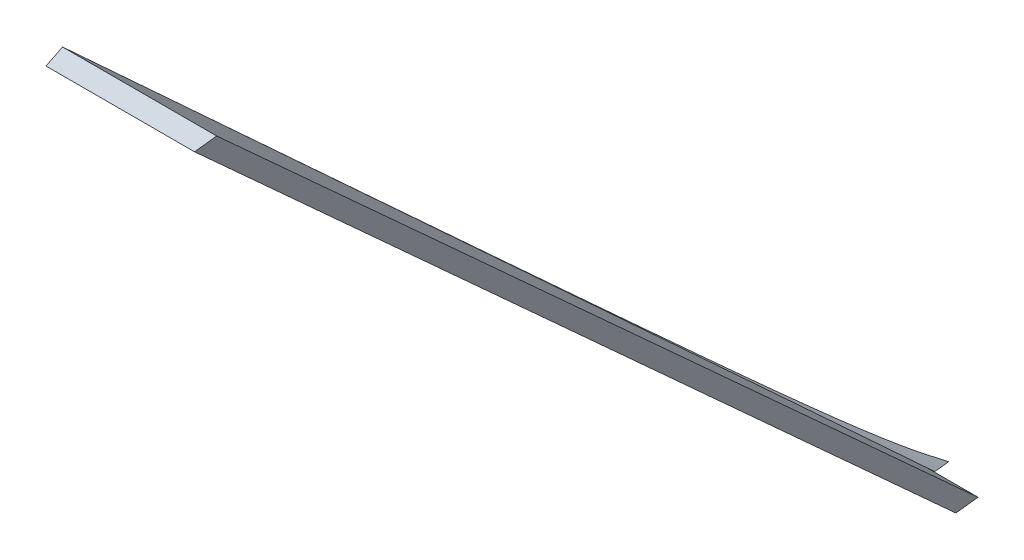
ISO-10303-21;
HEADER;
FILE_DESCRIPTION(('STEP AP214'),'2;1');
FILE_NAME('part.step','',(''),(''),'','','');
FILE_SCHEMA(('AUTOMOTIVE_DESIGN { 1 0 10303 214 1 1 1 1 }'));
ENDSEC;
DATA;
#1=APPLICATION_CONTEXT('core data for automotive mechanical design processes');
#2=APPLICATION_PROTOCOL_DEFINITION('international standard','automotive_design',2000,#1);
#3=PRODUCT_CONTEXT('',#1,'mechanical');
#4=PRODUCT('Part','Part','',(#3));
#5=PRODUCT_RELATED_PRODUCT_CATEGORY('part','',(#4));
#6=PRODUCT_DEFINITION_FORMATION('','',#4);
#7=PRODUCT_DEFINITION_CONTEXT('part definition',#1,'design');
#8=PRODUCT_DEFINITION('design','',#6,#7);
#9=PRODUCT_DEFINITION_SHAPE('','',#8);
#10=(LENGTH_UNIT() NAMED_UNIT(*) SI_UNIT(.MILLI.,.METRE.));
#11=(NAMED_UNIT(*) PLANE_ANGLE_UNIT() SI_UNIT($,.RADIAN.));
#12=(NAMED_UNIT(*) SI_UNIT($,.STERADIAN.) SOLID_ANGLE_UNIT());
#13=UNCERTAINTY_MEASURE_WITH_UNIT(LENGTH_MEASURE(1.E-05),#10,'distance_accuracy_value','');
#14=(GEOMETRIC_REPRESENTATION_CONTEXT(3) GLOBAL_UNCERTAINTY_ASSIGNED_CONTEXT((#13)) GLOBAL_UNIT_ASSIGNED_CONTEXT((#10,
#11,#12)) REPRESENTATION_CONTEXT('',''));
#15=CARTESIAN_POINT('',(0.,0.,0.));
#16=DIRECTION('',(0.,0.,1.));
#17=DIRECTION('',(1.,0.,0.));
#18=AXIS2_PLACEMENT_3D('',#15,#16,#17);
#19=CARTESIAN_POINT('',(48.6776760325675,362.607329490371,21.4180803513587));
#20=DIRECTION('',(0.915166256682117,0.0180699960875279,0.402671327352517));
#21=DIRECTION('',(0.402737084535447,0.,-0.91531570550269));
#22=AXIS2_PLACEMENT_3D('',#19,#20,#21);
#23=PLANE('',#22);
#24=CARTESIAN_POINT('',(-201.921191103714,369.968304155451,590.633216401593));
#25=DIRECTION('',(-0.266763292887405,-0.721758487054809,0.63867208482305));
#26=VECTOR('',#25,1.);
#27=LINE('',#24,#26);
#28=CARTESIAN_POINT('',(-201.921191103714,369.968304155451,590.633216401593));
#29=VERTEX_POINT('',#28);
#30=CARTESIAN_POINT('',(-204.997061337424,361.646186737307,597.997319736598));
#31=VERTEX_POINT('',#30);
#32=EDGE_CURVE('E257',#29,#31,#27,.T.);
#33=ORIENTED_EDGE('',*,*,#32,.F.);
#34=CARTESIAN_POINT('',(-25.8643819167033,37.8799147545019,205.404856215703));
#35=CARTESIAN_POINT('',(-26.2965330034078,38.4885291076643,206.35971047833));
#36=CARTESIAN_POINT('',(-26.7270469135784,39.104626881281,207.3105080476));
#37=CARTESIAN_POINT('',(-27.5850011057089,40.3504060767736,209.204508065537));
#38=CARTESIAN_POINT('',(-28.0124414998223,40.9800869996082,210.147710791494));
#39=CARTESIAN_POINT('',(-28.8639876643985,42.2509577981747,212.026021051234));
#40=CARTESIAN_POINT('',(-29.2880967234923,42.8921335003953,212.961136695253));
#41=CARTESIAN_POINT('',(-30.1336977521508,44.1854898042586,214.824926177428));
#42=CARTESIAN_POINT('',(-30.5551896950501,44.8376705177784,215.753599949961));
#43=CARTESIAN_POINT('',(-31.8155548898086,46.808221566628,218.529650221397));
#44=CARTESIAN_POINT('',(-32.6508287785659,48.1413674085533,220.368183257256));
#45=CARTESIAN_POINT('',(-34.3131055126675,50.838974083578,224.025046148229));
#46=CARTESIAN_POINT('',(-35.1401103179812,52.2034272307384,225.843380802748));
#47=CARTESIAN_POINT('',(-36.787373665056,54.9577253011071,229.463578161574));
#48=CARTESIAN_POINT('',(-37.6076326101415,56.3475686900306,231.265441851383));
#49=CARTESIAN_POINT('',(-39.2426276785469,59.1478380461247,234.8556936571));
#50=CARTESIAN_POINT('',(-40.0573636497886,60.5582645767193,236.644081402089));
#51=CARTESIAN_POINT('',(-41.6814179826039,63.3943103737166,240.207862308444));
#52=CARTESIAN_POINT('',(-42.4907410339778,64.8199126207872,241.983266892241));
#53=CARTESIAN_POINT('',(-44.105712407069,67.6848491173878,245.52510813595));
#54=CARTESIAN_POINT('',(-44.9113601830128,69.1241853141862,247.291543468077));
#55=CARTESIAN_POINT('',(-46.5196099944758,72.0141223214242,250.816986460717));
#56=CARTESIAN_POINT('',(-47.3222116272715,73.4647245490425,252.57599314235));
#57=CARTESIAN_POINT('',(-48.9248638326029,76.3751917844716,256.087792945075));
#58=CARTESIAN_POINT('',(-49.7249141657122,77.8350576252963,257.840585484632));
#59=CARTESIAN_POINT('',(-51.3228523739221,80.7624188327542,261.340913486921));
#60=CARTESIAN_POINT('',(-52.1207401572946,82.2299145155471,263.088448726993));
#61=CARTESIAN_POINT('',(-53.7146573583217,85.1711956975998,266.579013372145));
#62=CARTESIAN_POINT('',(-54.5106868047267,86.6449810985402,268.32204284698));
#63=CARTESIAN_POINT('',(-56.25632821841,89.8858706529682,272.143991796312));
#64=CARTESIAN_POINT('',(-57.2056067211694,91.6541078828564,274.222102546325));
#65=CARTESIAN_POINT('',(-59.1022614422828,95.1966119696952,278.373730071786));
#66=CARTESIAN_POINT('',(-60.0496378041691,96.9708783422341,280.447247195183));
#67=CARTESIAN_POINT('',(-61.9428303391441,100.524404118135,284.590511478522));
#68=CARTESIAN_POINT('',(-62.8886465871367,102.30366327001,286.660258819985));
#69=CARTESIAN_POINT('',(-64.7789957329516,105.866355440619,290.796649481234));
#70=CARTESIAN_POINT('',(-65.7235286603709,107.649788360421,292.863292872726));
#71=CARTESIAN_POINT('',(-67.6115371360341,111.22017935924,296.994018317751));
#72=CARTESIAN_POINT('',(-68.555012683519,113.007137440785,299.058100369447));
#73=CARTESIAN_POINT('',(-70.4413375242919,116.584525959615,303.184685338391));
#74=CARTESIAN_POINT('',(-71.3841865646098,118.374957236838,305.247187643013));
#75=CARTESIAN_POINT('',(-73.2691440034793,121.958368738736,309.370394583105));
#76=CARTESIAN_POINT('',(-74.2112523871742,123.751349012611,311.431099182602));
#77=CARTESIAN_POINT('',(-76.0948337789633,127.339477569891,315.550967049518));
#78=CARTESIAN_POINT('',(-77.0363067780074,129.134625883202,317.610130295027));
#79=CARTESIAN_POINT('',(-78.9187034675635,132.726772947788,321.727125312945));
#80=CARTESIAN_POINT('',(-79.8596271536788,134.523771713564,323.784957074712));
#81=CARTESIAN_POINT('',(-81.7409942698826,138.119358185298,327.899457798162));
#82=CARTESIAN_POINT('',(-82.6814376992262,139.91794589371,329.956126758042));
#83=CARTESIAN_POINT('',(-86.0950285678902,146.450310185385,337.421181197578));
#84=CARTESIAN_POINT('',(-88.5669504054922,151.188117232352,342.826600337891));
#85=CARTESIAN_POINT('',(-93.5087660549621,160.670269041806,353.63253606629));
#86=CARTESIAN_POINT('',(-95.9786598838697,165.414613748446,359.033052695608));
#87=CARTESIAN_POINT('',(-100.916980001921,174.908050963357,369.830537562461));
#88=CARTESIAN_POINT('',(-103.385406297159,179.657143451693,375.22750581474));
#89=CARTESIAN_POINT('',(-108.321176907092,189.158856031299,386.018824959229));
#90=CARTESIAN_POINT('',(-110.78852122237,193.911476120668,391.413175852848));
#91=CARTESIAN_POINT('',(-115.722077077461,203.418786689675,402.199210229338));
#92=CARTESIAN_POINT('',(-118.188288721341,208.17347682972,407.590893963964));
#93=CARTESIAN_POINT('',(-123.120084078611,217.684929334352,418.372741320305));
#94=CARTESIAN_POINT('',(-125.585667790772,222.441691702951,423.762904939044));
#95=CARTESIAN_POINT('',(-130.51634105581,231.956840545669,434.542036199928));
#96=CARTESIAN_POINT('',(-132.981430608144,236.715227021555,439.93100384076));
#97=CARTESIAN_POINT('',(-137.911214267097,246.233290147238,450.707982481147));
#98=CARTESIAN_POINT('',(-140.375908373643,250.992966797272,456.095993480527));
#99=CARTESIAN_POINT('',(-145.304992991091,260.513391518738,466.871277405703));
#100=CARTESIAN_POINT('',(-147.769383499914,265.274139596937,472.258550326471));
#101=CARTESIAN_POINT('',(-152.697902045965,274.796482770925,483.032461628782));
#102=CARTESIAN_POINT('',(-155.162030083339,279.558077866241,488.419100010678));
#103=CARTESIAN_POINT('',(-160.090069697005,289.081967624749,499.191853421918));
#104=CARTESIAN_POINT('',(-162.553981273375,293.844262287687,504.577968451452));
#105=CARTESIAN_POINT('',(-167.481624290135,303.369435238096,515.349762918382));
#106=CARTESIAN_POINT('',(-169.945355730557,308.132313525462,520.735442355855));
#107=CARTESIAN_POINT('',(-174.872988550427,317.659182155336,531.507137553807));
#108=CARTESIAN_POINT('',(-177.336889910184,322.423172561879,536.893153266659));
#109=CARTESIAN_POINT('',(-182.264564915093,331.951570908876,547.664875693622));
#110=CARTESIAN_POINT('',(-184.728338560222,336.715978849405,553.050582407678));
#111=CARTESIAN_POINT('',(-189.655777430499,346.245151684005,563.821733407226));
#112=CARTESIAN_POINT('',(-192.119442655608,351.0099165782,569.207177692627));
#113=CARTESIAN_POINT('',(-197.046679897087,360.539756017879,579.977840528727));
#114=CARTESIAN_POINT('',(-199.510251913407,365.304830563524,585.363059079308));
#115=CARTESIAN_POINT('',(-201.973784077308,370.070034632494,590.7481812434));
#116=B_SPLINE_CURVE_WITH_KNOTS('',3,(#34,#35,#36,#37,#38,#39,#40,#41,#42,#43,#44,#45,#46,#47,
#48,#49,#50,#51,#52,#53,#54,#55,#56,#57,#58,#59,#60,#61,#62,#63,#64,#65,#66,#67,#68,#69,#70,#71,
#72,#73,#74,#75,#76,#77,#78,#79,#80,#81,#82,#83,#84,#85,#86,#87,#88,#89,#90,#91,#92,#93,#94,#95,
#96,#97,#98,#99,#100,#101,#102,#103,#104,#105,#106,#107,#108,#109,#110,#111,#112,#113,#114,
#115),.UNSPECIFIED.,.F.,.F.,(4,2,2,2,2,2,2,2,2,2,2,2,2,2,2,2,2,2,2,2,2,2,2,2,2,2,2,2,2,2,2,2,2,
2,2,2,2,2,2,2,4),(0.,3.63589817961035,7.27166300401618,10.9032171180098,14.5348081726657,
21.7936224964146,29.0506734562355,36.3072873271673,43.5641002079314,50.8134889231137,
58.063921235373,65.3152808645544,72.5673020704696,79.8196262138649,87.0718374027661,
95.7388322050663,104.405146387563,113.071031611809,121.736713463758,130.40240153141,
139.070543318612,147.738854753588,156.40728715547,165.075788015105,173.744302278986,
196.547406433229,219.350316991643,242.153132202748,264.95593513122,287.755842110555,
310.555793425048,333.35576963441,356.155750027319,378.955878689101,401.755994656698,
424.556102340985,447.35620596664,470.15928069067,492.962359494544,515.765446312218,
538.568545038479),.UNSPECIFIED.);
#117=CARTESIAN_POINT('',(-25.8641979114218,37.8797293807954,205.404446339571));
#118=VERTEX_POINT('',#117);
#119=EDGE_CURVE('E261',#118,#29,#116,.T.);
#120=ORIENTED_EDGE('',*,*,#119,.F.);
#121=CARTESIAN_POINT('',(-25.8639221740813,37.8796284871992,205.403824188104));
#122=CARTESIAN_POINT('',(-26.54789815499,37.2499284833835,206.986580076885));
#123=CARTESIAN_POINT('',(-27.2365797462856,36.6487853937523,208.57874908331));
#124=CARTESIAN_POINT('',(-28.6219456591585,35.5070033813506,211.778560059562));
#125=CARTESIAN_POINT('',(-29.318618869796,34.9662895768166,213.386180137479));
#126=CARTESIAN_POINT('',(-30.7237515230632,33.9446382933494,216.625524825149));
#127=CARTESIAN_POINT('',(-31.4322522777685,33.4640104957504,218.257329429366));
#128=CARTESIAN_POINT('',(-32.8578382840548,32.5676415913905,221.537537136793));
#129=CARTESIAN_POINT('',(-33.574933233787,32.1519830681102,223.185958575397));
#130=CARTESIAN_POINT('',(-34.2955258306848,31.7704022719176,224.84079999998));
#131=B_SPLINE_CURVE_WITH_KNOTS('',3,(#121,#122,#123,#124,#125,#126,#127,#128,#129,#130),
.UNSPECIFIED.,.F.,.F.,(4,2,2,2,4),(0.,5.50668207721765,11.0064629897918,16.5335133876659,
22.0675331542072),.UNSPECIFIED.);
#132=CARTESIAN_POINT('',(-33.7107945039055,32.0879297490942,223.497637745172));
#133=VERTEX_POINT('',#132);
#134=EDGE_CURVE('E279',#118,#133,#131,.T.);
#135=ORIENTED_EDGE('',*,*,#134,.T.);
#136=CARTESIAN_POINT('',(-33.2558859656816,30.9171201408934,222.516262703179));
#137=CARTESIAN_POINT('',(-33.3529531400182,31.1680144958528,222.725611958628));
#138=CARTESIAN_POINT('',(-33.4501614262258,31.4185738760477,222.935296956421));
#139=CARTESIAN_POINT('',(-33.644853330382,31.9190356354269,223.355322191918));
#140=CARTESIAN_POINT('',(-33.742336948344,32.1689380145794,223.565662429653));
#141=CARTESIAN_POINT('',(-34.0156267537734,32.8676603748001,224.155423065133));
#142=CARTESIAN_POINT('',(-34.1917333846187,33.3157594663579,224.535558641963));
#143=CARTESIAN_POINT('',(-34.36825457695,33.7628533266945,224.916681518312));
#144=B_SPLINE_CURVE_WITH_KNOTS('',3,(#136,#137,#138,#139,#140,#141,#142,#143),.UNSPECIFIED.,.F.,
.F.,(4,2,2,4),(0.,1.02263031321406,2.04526067597971,3.88557496084136),.UNSPECIFIED.);
#145=CARTESIAN_POINT('',(-33.8861940552726,32.5362896003207,223.876126897563));
#146=VERTEX_POINT('',#145);
#147=EDGE_CURVE('E282',#133,#146,#144,.T.);
#148=ORIENTED_EDGE('',*,*,#147,.T.);
#149=DIRECTION('',(0.266763291800928,0.721758487280027,-0.638672085022338));
#150=VECTOR('',#149,1.);
#151=CARTESIAN_POINT('',(-34.33437479214,31.3237560529392,224.949136876974));
#152=LINE('',#151,#150);
#153=CARTESIAN_POINT('',(-34.2891241813679,31.4461867373069,224.84079999998));
#154=VERTEX_POINT('',#153);
#155=EDGE_CURVE('E107',#146,#154,#152,.F.);
#156=ORIENTED_EDGE('',*,*,#155,.T.);
#157=DIRECTION('',(0.324104895833965,-0.62691541117386,-0.708472359185004));
#158=VECTOR('',#157,1.);
#159=CARTESIAN_POINT('',(-46.1515914517281,54.3917319664172,250.771386920495));
#160=LINE('',#159,#158);
#161=EDGE_CURVE('E276',#31,#154,#160,.T.);
#162=ORIENTED_EDGE('',*,*,#161,.F.);
#163=EDGE_LOOP('',(#33,#120,#135,#148,#156,#162));
#164=FACE_BOUND('',#163,.T.);
#165=ADVANCED_FACE('F38',(#164),#23,.F.);
#166=CARTESIAN_POINT('',(159.440890218229,313.348268491755,89.3256315210229));
#167=DIRECTION('',(-0.843459103537497,0.255501074852022,-0.472541999624567));
#168=DIRECTION('',(-0.488764700454788,0.,0.872415650701741));
#169=AXIS2_PLACEMENT_3D('',#166,#167,#168);
#170=PLANE('',#169);
#171=DIRECTION('',(-0.513309975276949,-0.642705823376138,0.568719697108847));
#172=VECTOR('',#171,1.);
#173=CARTESIAN_POINT('',(-10.582845755189,20.5425692053769,234.489229864168));
#174=LINE('',#173,#172);
#175=CARTESIAN_POINT('',(-1.87445158451926,31.4461867373068,224.84079999998));
#176=VERTEX_POINT('',#175);
#177=CARTESIAN_POINT('',(4.77217542707278,39.7683041554508,217.476696664975));
#178=VERTEX_POINT('',#177);
#179=EDGE_CURVE('E100',#176,#178,#174,.F.);
#180=ORIENTED_EDGE('',*,*,#179,.T.);
#181=DIRECTION('',(-0.213764834318811,0.647368565890785,0.731586314459996));
#182=VECTOR('',#181,1.);
#183=CARTESIAN_POINT('',(-5.97822301774842,72.3249688012315,254.268736863194));
#184=LINE('',#183,#182);
#185=CARTESIAN_POINT('',(-104.261769084808,369.968304155451,590.633216401593));
#186=VERTEX_POINT('',#185);
#187=EDGE_CURVE('E91',#178,#186,#184,.T.);
#188=ORIENTED_EDGE('',*,*,#187,.T.);
#189=DIRECTION('',(-0.513309975276949,-0.642705823376138,0.568719697108847));
#190=VECTOR('',#189,1.);
#191=CARTESIAN_POINT('',(-135.699548533921,330.605648257212,625.464576139786));
#192=LINE('',#191,#190);
#193=CARTESIAN_POINT('',(-110.9083960964,361.646186737307,597.997319736598));
#194=VERTEX_POINT('',#193);
#195=EDGE_CURVE('E277',#186,#194,#192,.T.);
#196=ORIENTED_EDGE('',*,*,#195,.T.);
#197=DIRECTION('',(-0.213764834318811,0.647368565890785,0.731586314459996));
#198=VECTOR('',#197,1.);
#199=CARTESIAN_POINT('',(-12.3211297202073,63.0830603352195,260.59339129963));
#200=LINE('',#199,#198);
#201=EDGE_CURVE('E104',#176,#194,#200,.T.);
#202=ORIENTED_EDGE('',*,*,#201,.F.);
#203=EDGE_LOOP('',(#180,#188,#196,#202));
#204=FACE_BOUND('',#203,.T.);
#205=ADVANCED_FACE('F103',(#204),#170,.F.);
#206=CARTESIAN_POINT('',(-26.9939307547615,39.7683041554507,217.476696664976));
#207=CARTESIAN_POINT('',(-26.4877957951712,38.9389280460651,216.539425003767));
#208=CARTESIAN_POINT('',(-25.979334962238,38.1102230661662,215.60291178091));
#209=CARTESIAN_POINT('',(-25.4683574331419,37.2822442775747,214.66721922135));
#210=CARTESIAN_POINT('',(-25.4632476578509,37.2739644896888,214.657862295755));
#211=CARTESIAN_POINT('',(-25.45813788256,37.2656847018029,214.648505370159));
#212=CARTESIAN_POINT('',(-25.453028107269,37.2574049139169,214.639148444563));
#213=B_SPLINE_CURVE_WITH_KNOTS('',3,(#206,#207,#208,#209,#210,#211,#212),.UNSPECIFIED.,.F.,.F.,
(4,3,4),(0.,1.,1.01),.UNSPECIFIED.);
#214=DIRECTION('',(0.610722946119665,0.497356328708973,-0.616160827524802));
#215=VECTOR('',#214,1.);
#216=SURFACE_OF_LINEAR_EXTRUSION('',#213,#215);
#217=ORIENTED_EDGE('',*,*,#147,.F.);
#218=CARTESIAN_POINT('',(-25.4682507950668,37.2815591312125,214.666850913678));
#219=CARTESIAN_POINT('',(-25.8107569913545,37.0363681088513,215.023801182977));
#220=CARTESIAN_POINT('',(-26.1537587887213,36.7943873287998,215.382484098822));
#221=CARTESIAN_POINT('',(-26.8399448550303,36.3175401686352,216.102505893886));
#222=CARTESIAN_POINT('',(-27.1831270212552,36.0826591617276,216.463837091255));
#223=CARTESIAN_POINT('',(-27.8696522126552,35.6201098219812,217.189155534571));
#224=CARTESIAN_POINT('',(-28.2129933147246,35.3924271021711,217.553135423187));
#225=CARTESIAN_POINT('',(-28.8998101272097,34.9443744463578,218.283750693345));
#226=CARTESIAN_POINT('',(-29.2432841013473,34.7239904040585,218.65037905467));
#227=CARTESIAN_POINT('',(-29.9303374505354,34.2906363876845,219.386290867614));
#228=CARTESIAN_POINT('',(-30.2739152782661,34.0776526331917,219.755567647061));
#229=CARTESIAN_POINT('',(-30.9611435001056,33.6592018237428,220.496775764768));
#230=CARTESIAN_POINT('',(-31.3047925377511,33.4537213621527,220.868700790415));
#231=CARTESIAN_POINT('',(-31.9921273122615,33.0503810027858,221.615205072993));
#232=CARTESIAN_POINT('',(-32.3358118825165,32.8525081234903,221.989778387693));
#233=CARTESIAN_POINT('',(-33.023176716626,32.4644882164908,222.741578075418));
#234=CARTESIAN_POINT('',(-33.3668560044359,32.2743286867293,223.118798889117));
#235=CARTESIAN_POINT('',(-33.710787002775,32.0879369899787,223.49764811685));
#236=B_SPLINE_CURVE_WITH_KNOTS('',3,(#218,#219,#220,#221,#222,#223,#224,#225,#226,#227,#228,
#229,#230,#231,#232,#233,#234,#235),.UNSPECIFIED.,.F.,.F.,(4,2,2,2,2,2,2,2,4),(0.,
1.65636728818121,3.30905047300676,4.95818959022487,6.60392937084371,8.24641950226396,
9.88581490130743,11.5222759994237,13.1559690403205),.UNSPECIFIED.);
#237=CARTESIAN_POINT('',(-25.4683574331419,37.2822442775747,214.66721922135));
#238=VERTEX_POINT('',#237);
#239=EDGE_CURVE('E243',#238,#133,#236,.T.);
#240=ORIENTED_EDGE('',*,*,#239,.F.);
#241=CARTESIAN_POINT('',(-25.4683574331419,37.2822442775747,214.66721922135));
#242=CARTESIAN_POINT('',(-25.979334962238,38.1102230661662,215.60291178091));
#243=CARTESIAN_POINT('',(-26.4877957951712,38.9389280460651,216.539425003767));
#244=CARTESIAN_POINT('',(-26.9939307547615,39.7683041554507,217.476696664976));
#245=B_SPLINE_CURVE_WITH_KNOTS('',3,(#241,#242,#243,#244),.UNSPECIFIED.,.F.,.F.,(4,4),(0.,1.),.UNSPECIFIED.);
#246=CARTESIAN_POINT('',(-26.9939307547616,39.7683041554508,217.476696664976));
#247=VERTEX_POINT('',#246);
#248=EDGE_CURVE('E110',#238,#247,#245,.T.);
#249=ORIENTED_EDGE('',*,*,#248,.T.);
#250=CARTESIAN_POINT('',(-26.9939307547615,39.7683041554508,217.476696664976));
#251=CARTESIAN_POINT('',(-27.2811644240174,39.4669569012651,217.743316614172));
#252=CARTESIAN_POINT('',(-27.5683935485325,39.1656091968127,218.009940950574));
#253=CARTESIAN_POINT('',(-28.1428380142159,38.5629177650274,218.543194118052));
#254=CARTESIAN_POINT('',(-28.4300533555322,38.2615740377093,218.809822948984));
#255=CARTESIAN_POINT('',(-29.0044701936728,37.6588905778359,219.343085125461));
#256=CARTESIAN_POINT('',(-29.2916716906465,37.3575508452953,219.609718470861));
#257=CARTESIAN_POINT('',(-29.8660607789548,36.7548753926204,220.142989696214));
#258=CARTESIAN_POINT('',(-30.15324837044,36.4535396725009,220.409627576021));
#259=CARTESIAN_POINT('',(-30.7276095866244,35.8508722623116,220.942907890127));
#260=CARTESIAN_POINT('',(-31.0147832114755,35.5495405722567,221.209550324279));
#261=CARTESIAN_POINT('',(-31.589116433245,34.94688123984,221.742839767017));
#262=CARTESIAN_POINT('',(-31.8762760303165,34.6455535974932,222.009486775454));
#263=CARTESIAN_POINT('',(-32.4505811353803,34.0429023781361,222.5427853867));
#264=CARTESIAN_POINT('',(-32.7377266435271,33.7415788011409,222.80943698936));
#265=CARTESIAN_POINT('',(-33.3120035095926,33.1389357301307,223.342744808993));
#266=CARTESIAN_POINT('',(-33.5991348676672,32.837616236131,223.609401025816));
#267=CARTESIAN_POINT('',(-33.8862615174222,32.5362962765711,223.876061786248));
#268=B_SPLINE_CURVE_WITH_KNOTS('',3,(#250,#251,#252,#253,#254,#255,#256,#257,#258,#259,#260,
#261,#262,#263,#264,#265,#266,#267),.UNSPECIFIED.,.F.,.F.,(4,2,2,2,2,2,2,2,4),(0.,
1.48310347275798,2.96618292086754,4.44923823873848,5.93226932079372,7.41527606146944,
8.89825835521506,10.3812160964936,11.8641491797811),.UNSPECIFIED.);
#269=EDGE_CURVE('E56',#247,#146,#268,.T.);
#270=ORIENTED_EDGE('',*,*,#269,.T.);
#271=EDGE_LOOP('',(#217,#240,#249,#270));
#272=FACE_BOUND('',#271,.T.);
#273=ADVANCED_FACE('F138',(#272),#216,.T.);
#274=CARTESIAN_POINT('',(-35.0117037185917,31.3766796815384,196.277230001507));
#275=CARTESIAN_POINT('',(-35.0157461343784,31.3817222268896,205.798420188865));
#276=CARTESIAN_POINT('',(-35.0199491180738,31.3878443702237,215.319611182266));
#277=CARTESIAN_POINT('',(-35.0237910693588,31.3953036336931,224.84079999998));
#278=CARTESIAN_POINT('',(-34.9249999999667,31.4461867373069,196.277230001507));
#279=CARTESIAN_POINT('',(-34.9249999999667,31.4461867373069,205.798420000998));
#280=CARTESIAN_POINT('',(-34.9249999999667,31.4461867373069,215.319610000489));
#281=CARTESIAN_POINT('',(-34.9249999999667,31.4461867373069,224.84079999998));
#282=CARTESIAN_POINT('',(-26.254628137468,38.3968923141524,196.277230001507));
#283=CARTESIAN_POINT('',(-25.8503865587904,37.892637779031,205.798401214307));
#284=CARTESIAN_POINT('',(-25.4300881892536,37.2804234456176,215.319491822811));
#285=CARTESIAN_POINT('',(-25.0458930607559,36.5344970986781,224.84079999998));
#286=B_SPLINE_SURFACE_WITH_KNOTS('',1,3,((#274,#275,#276,#277),(#278,#279,#280,#281),(#282,#283,
#284,#285)),.UNSPECIFIED.,.F.,.F.,.F.,(2,1,2),(4,4),(-0.01,0.,1.),(-0.0142817849992367,
0.0142817849992367),.UNSPECIFIED.);
#287=CARTESIAN_POINT('',(-25.8639972270601,37.8795205180076,205.404425103434));
#288=CARTESIAN_POINT('',(-25.8474148755227,37.8561733639089,205.790383523465));
#289=CARTESIAN_POINT('',(-25.8308340438463,37.8326360108261,206.176330507239));
#290=CARTESIAN_POINT('',(-25.7976813809467,37.7851761391595,206.948224564138));
#291=CARTESIAN_POINT('',(-25.7811095503261,37.7612535974532,207.334171635868));
#292=CARTESIAN_POINT('',(-25.7479818377743,37.713019919558,208.106065910723));
#293=CARTESIAN_POINT('',(-25.7314259568799,37.688708759704,208.492013112414));
#294=CARTESIAN_POINT('',(-25.6983370913901,37.6396944174328,209.263907686421));
#295=CARTESIAN_POINT('',(-25.6818041082787,37.6149912107911,209.649855057262));
#296=CARTESIAN_POINT('',(-25.6487679860778,37.5651893466494,210.421750009618));
#297=CARTESIAN_POINT('',(-25.6322648489331,37.5400906643479,210.807697589616));
#298=CARTESIAN_POINT('',(-25.5992953662475,37.4894944207663,211.579592999882));
#299=CARTESIAN_POINT('',(-25.5828290231263,37.4639968340891,211.965540828588));
#300=CARTESIAN_POINT('',(-25.5499400762024,37.4125993533744,212.737436776865));
#301=CARTESIAN_POINT('',(-25.533517475309,37.3866994333249,213.123384894829));
#302=CARTESIAN_POINT('',(-25.5007229598443,37.3344938585831,213.895281458684));
#303=CARTESIAN_POINT('',(-25.4843510486875,37.3081881772437,214.281229902919));
#304=CARTESIAN_POINT('',(-25.4680085030026,37.2816788012828,214.66716560405));
#305=B_SPLINE_CURVE_WITH_KNOTS('',3,(#287,#288,#289,#290,#291,#292,#293,#294,#295,#296,#297,
#298,#299,#300,#301,#302,#303,#304),.UNSPECIFIED.,.F.,.F.,(4,2,2,2,2,2,2,2,4),(0.,
1.16105796497692,2.32218588922035,3.48338479226191,4.64465572700473,5.80599978110805,
6.96741807837082,8.1289117801145,9.29048208656514),.UNSPECIFIED.);
#306=EDGE_CURVE('E48',#118,#238,#305,.T.);
#307=ORIENTED_EDGE('',*,*,#134,.F.);
#308=ORIENTED_EDGE('',*,*,#306,.T.);
#309=ORIENTED_EDGE('',*,*,#239,.T.);
#310=EDGE_LOOP('',(#307,#308,#309));
#311=FACE_BOUND('',#310,.T.);
#312=ADVANCED_FACE('F147',(#311),#286,.T.);
#313=CARTESIAN_POINT('',(-204.997061337424,361.646186737307,597.997319736598));
#314=DIRECTION('',(0.,0.662686464342369,0.748896955513514));
#315=DIRECTION('',(1.,0.,0.));
#316=AXIS2_PLACEMENT_3D('',#313,#314,#315);
#317=PLANE('',#316);
#318=ORIENTED_EDGE('',*,*,#195,.F.);
#319=DIRECTION('',(1.,0.,0.));
#320=VECTOR('',#319,1.);
#321=CARTESIAN_POINT('',(0.,369.968304155451,590.633216401593));
#322=LINE('',#321,#320);
#323=EDGE_CURVE('E97',#29,#186,#322,.T.);
#324=ORIENTED_EDGE('',*,*,#323,.F.);
#325=ORIENTED_EDGE('',*,*,#32,.T.);
#326=DIRECTION('',(1.,0.,0.));
#327=VECTOR('',#326,1.);
#328=CARTESIAN_POINT('',(-204.997061337424,361.646186737307,597.997319736598));
#329=LINE('',#328,#327);
#330=EDGE_CURVE('E113',#31,#194,#329,.T.);
#331=ORIENTED_EDGE('',*,*,#330,.T.);
#332=EDGE_LOOP('',(#318,#324,#325,#331));
#333=FACE_BOUND('',#332,.T.);
#334=ADVANCED_FACE('F183',(#333),#317,.T.);
#335=CARTESIAN_POINT('',(-34.9249999999667,31.4461867373069,196.277230001507));
#336=CARTESIAN_POINT('',(-299.633713521394,361.646186737307,502.336811715639));
#337=CARTESIAN_POINT('',(-34.9249999999667,31.4461867373069,201.037825001252));
#338=CARTESIAN_POINT('',(-283.860938157399,361.646186737307,518.280229719132));
#339=CARTESIAN_POINT('',(-34.9249999999667,31.4461867373069,205.798420000998));
#340=CARTESIAN_POINT('',(-268.088162793404,361.646186737307,534.223647722626));
#341=CARTESIAN_POINT('',(-34.9249999999667,31.4461867373069,215.319610000489));
#342=CARTESIAN_POINT('',(-236.542612065414,361.646186737307,566.110483729612));
#343=CARTESIAN_POINT('',(-34.9249999999667,31.4461867373069,220.080205000235));
#344=CARTESIAN_POINT('',(-220.769836701419,361.646186737307,582.053901733105));
#345=CARTESIAN_POINT('',(-34.9249999999667,31.4461867373069,224.84079999998));
#346=CARTESIAN_POINT('',(-204.997061337424,361.646186737307,597.997319736598));
#347=B_SPLINE_SURFACE_WITH_KNOTS('',3,1,((#335,#336),(#337,#338),(#339,#340),(#341,#342),(#343,
#344),(#345,#346)),.UNSPECIFIED.,.F.,.F.,.F.,(4,2,4),(2,2),(0.,0.5,1.),(0.,1.),.UNSPECIFIED.);
#348=OFFSET_SURFACE('',#347,-11.1125,.F.);
#349=ORIENTED_EDGE('',*,*,#306,.F.);
#350=ORIENTED_EDGE('',*,*,#119,.T.);
#351=CARTESIAN_POINT('',(-221.947476469895,408.718779783887,634.424835491981));
#352=CARTESIAN_POINT('',(-219.031873084429,403.075341133981,628.047228205652));
#353=CARTESIAN_POINT('',(-216.115944501535,397.431976258562,621.669704291311));
#354=CARTESIAN_POINT('',(-210.283334625544,386.145417249132,608.914849416202));
#355=CARTESIAN_POINT('',(-207.366653332437,380.502223115124,602.537518455437));
#356=CARTESIAN_POINT('',(-201.532435788347,369.216028911958,589.783075845125));
#357=CARTESIAN_POINT('',(-198.614899537361,363.573028842801,583.405964195579));
#358=CARTESIAN_POINT('',(-192.778715095216,352.28700141034,570.651710051578));
#359=CARTESIAN_POINT('',(-189.860066860461,346.643974056936,564.274567568311));
#360=CARTESIAN_POINT('',(-184.021635450934,335.358177193598,551.52057398873));
#361=CARTESIAN_POINT('',(-181.101852276165,329.715407683663,545.143722892415));
#362=CARTESIAN_POINT('',(-175.260965136491,318.430168812449,532.390359895509));
#363=CARTESIAN_POINT('',(-172.339861171575,312.787699451174,526.01384799492));
#364=CARTESIAN_POINT('',(-166.496101744269,301.50310819896,513.261216867342));
#365=CARTESIAN_POINT('',(-163.573446280564,295.860986308322,506.88509764069));
#366=CARTESIAN_POINT('',(-157.726302820152,284.577159569105,494.133330483461));
#367=CARTESIAN_POINT('',(-154.801814823458,278.935454720524,487.757682552881));
#368=CARTESIAN_POINT('',(-148.950649852599,267.652543604112,475.00695013405));
#369=CARTESIAN_POINT('',(-146.023972878466,262.011337336274,468.631865645792));
#370=CARTESIAN_POINT('',(-140.168103678756,250.729773046007,455.882655264989));
#371=CARTESIAN_POINT('',(-137.238911568363,245.089414997323,449.508529342775));
#372=CARTESIAN_POINT('',(-131.377297187055,233.809435835276,436.761110303372));
#373=CARTESIAN_POINT('',(-128.444874916064,228.169814721931,430.387817186203));
#374=CARTESIAN_POINT('',(-122.576030984273,216.891485444172,417.64226266854));
#375=CARTESIAN_POINT('',(-119.63960932293,211.252777279882,411.270001268187));
#376=CARTESIAN_POINT('',(-114.496543944306,201.386206430562,400.119864260716));
#377=CARTESIAN_POINT('',(-112.291002909502,197.158091338509,395.341703410332));
#378=CARTESIAN_POINT('',(-107.876507676785,188.702643741057,385.786266104819));
#379=CARTESIAN_POINT('',(-105.667553478957,184.475311235639,381.008989649667));
#380=CARTESIAN_POINT('',(-101.245498817617,176.021599364403,371.455513875208));
#381=CARTESIAN_POINT('',(-99.0323983548114,171.795219998422,366.679314555716));
#382=CARTESIAN_POINT('',(-94.6010948736201,163.343636185725,357.128243684098));
#383=CARTESIAN_POINT('',(-92.3828918554841,159.118431738952,352.353372131906));
#384=CARTESIAN_POINT('',(-87.939828379686,150.668934224531,342.804658970172));
#385=CARTESIAN_POINT('',(-85.7149670815932,146.444641350905,338.030817579892));
#386=CARTESIAN_POINT('',(-81.2571769252357,137.997924499567,328.485246824453));
#387=CARTESIAN_POINT('',(-79.0242480662282,133.775500522027,323.713517459489));
#388=CARTESIAN_POINT('',(-74.5480038688019,125.333063082329,314.172782834741));
#389=CARTESIAN_POINT('',(-72.3046885168635,121.113049623317,309.403777578513));
#390=CARTESIAN_POINT('',(-68.9294439995874,114.785423690013,302.252975423859));
#391=CARTESIAN_POINT('',(-67.8026477122276,112.676608750408,299.869819628487));
#392=CARTESIAN_POINT('',(-65.5450830061529,108.459912922447,295.104563601988));
#393=CARTESIAN_POINT('',(-64.4143145881381,106.352032033927,292.722463370675));
#394=CARTESIAN_POINT('',(-62.3746366279632,102.55856139985,288.435490931138));
#395=CARTESIAN_POINT('',(-61.4665570419225,100.872775690167,286.530397265338));
#396=CARTESIAN_POINT('',(-59.6470511684954,97.501999077016,282.721108138225));
#397=CARTESIAN_POINT('',(-58.7356248839794,95.8170081728679,280.816912676142));
#398=CARTESIAN_POINT('',(-56.9089728183892,92.4479409559742,277.009555324795));
#399=CARTESIAN_POINT('',(-55.993747057526,90.7638646384173,275.106393430094));
#400=CARTESIAN_POINT('',(-54.1589624688535,87.3967656055724,271.301260308637));
#401=CARTESIAN_POINT('',(-53.2394036796941,85.7137428810377,269.399289071432));
#402=CARTESIAN_POINT('',(-51.3953237635071,82.348912865867,265.596720149668));
#403=CARTESIAN_POINT('',(-50.470802692501,80.6671055617517,263.696122449877));
#404=CARTESIAN_POINT('',(-48.6163522924223,77.3054371739947,259.897126459313));
#405=CARTESIAN_POINT('',(-47.6864248727209,75.6255756279478,257.998727645981));
#406=CARTESIAN_POINT('',(-45.8199750162911,72.2674615151136,254.203748314595));
#407=CARTESIAN_POINT('',(-44.8834525791122,70.5892089484361,252.307167796666));
#408=CARTESIAN_POINT('',(-43.0027549289559,67.2345578846553,248.516102030793));
#409=CARTESIAN_POINT('',(-42.0585795993312,65.5581594162567,246.621616815289));
#410=CARTESIAN_POINT('',(-40.1613197990192,62.2075108358573,242.835074225579));
#411=CARTESIAN_POINT('',(-39.2082350220846,60.5332607999715,240.94301693739));
#412=CARTESIAN_POINT('',(-37.2916653142062,57.1872606395044,237.161727491847));
#413=CARTESIAN_POINT('',(-36.3281797664189,55.5155106699646,235.272495509705));
#414=CARTESIAN_POINT('',(-34.5499678056329,52.452177171129,231.81064551813));
#415=CARTESIAN_POINT('',(-33.7370799595073,51.0601250896957,230.237498001474));
#416=CARTESIAN_POINT('',(-32.1017081455512,48.2784742483163,227.093975448199));
#417=CARTESIAN_POINT('',(-31.2792240422708,46.8888755233187,225.523600451074));
#418=CARTESIAN_POINT('',(-29.623357112508,44.1125812188178,222.386131279566));
#419=CARTESIAN_POINT('',(-28.7899746290579,42.7258855495255,220.819037003712));
#420=CARTESIAN_POINT('',(-27.110815907806,39.9558981248607,217.68869518935));
#421=CARTESIAN_POINT('',(-26.265040498566,38.5726061490822,216.125447401764));
#422=CARTESIAN_POINT('',(-24.5593928928446,35.8099822286958,213.003427027831));
#423=CARTESIAN_POINT('',(-23.6995219369961,34.4306499479964,211.444654061671));
#424=CARTESIAN_POINT('',(-21.9637570677773,31.6765608458718,208.332278821231));
#425=CARTESIAN_POINT('',(-21.0878645964499,30.3018036256975,206.778676096327));
#426=CARTESIAN_POINT('',(-19.3168531109185,27.5559235605662,203.675577826435));
#427=CARTESIAN_POINT('',(-18.4217137852165,26.1848064626618,202.126088776146));
#428=CARTESIAN_POINT('',(-16.6107987530555,23.4485756058624,199.033895003526));
#429=CARTESIAN_POINT('',(-15.695023199647,22.083461802533,197.491190230979));
#430=CARTESIAN_POINT('',(-13.8402086245744,19.3600710644702,194.413506979318));
#431=CARTESIAN_POINT('',(-12.9011680122462,18.0017946048969,192.878529037179));
#432=CARTESIAN_POINT('',(-10.9969733587291,15.2929834289366,189.817322038254));
#433=CARTESIAN_POINT('',(-10.0318144213619,13.9424502224262,188.291094687769));
#434=CARTESIAN_POINT('',(-8.07232977069124,11.2500841281996,185.248472151189));
#435=CARTESIAN_POINT('',(-7.07799356608083,9.90825458718354,183.732080747176));
#436=CARTESIAN_POINT('',(-5.05690637066457,7.23434884551435,180.71032011524));
#437=CARTESIAN_POINT('',(-4.03013609944468,5.90227904895933,179.204958124542));
#438=CARTESIAN_POINT('',(-2.98595689003659,4.57618175692742,177.706345615981));
#439=B_SPLINE_CURVE_WITH_KNOTS('',3,(#351,#352,#353,#354,#355,#356,#357,#358,#359,#360,#361,
#362,#363,#364,#365,#366,#367,#368,#369,#370,#371,#372,#373,#374,#375,#376,#377,#378,#379,#380,
#381,#382,#383,#384,#385,#386,#387,#388,#389,#390,#391,#392,#393,#394,#395,#396,#397,#398,#399,
#400,#401,#402,#403,#404,#405,#406,#407,#408,#409,#410,#411,#412,#413,#414,#415,#416,#417,#418,
#419,#420,#421,#422,#423,#424,#425,#426,#427,#428,#429,#430,#431,#432,#433,#434,#435,#436,#437,
#438),.UNSPECIFIED.,.F.,.F.,(4,2,2,2,2,2,2,2,2,2,2,2,2,2,2,2,2,2,2,2,2,2,2,2,2,2,2,2,2,2,2,2,2,
2,2,2,2,2,2,2,2,2,2,4),(0.,27.0038360018643,54.0076723563176,81.0115087890936,108.016543498047,
135.021578175389,162.026613060885,189.031670876284,216.036728518326,243.041785775336,
270.045666067214,297.049547000679,324.053431598492,344.305583957141,364.557735812067,
384.809884213126,405.062031620825,425.316853307724,445.571676859707,465.826526784087,
475.954003043654,486.081477518108,494.184732581826,502.287980697172,510.391185762932,
518.494318685797,526.597360320231,534.697695703841,542.798031640533,550.898491277438,
558.999230385406,567.10045259655,573.857687841114,580.615018578928,587.372137135613,
594.128805970141,600.884883269553,607.640355440384,614.403345428856,621.166285275454,
627.929688796623,634.694369100139,641.461512336717,648.232756941212),.UNSPECIFIED.);
#440=EDGE_CURVE('E11',#247,#29,#439,.F.);
#441=ORIENTED_EDGE('',*,*,#440,.F.);
#442=ORIENTED_EDGE('',*,*,#248,.F.);
#443=EDGE_LOOP('',(#349,#350,#441,#442));
#444=FACE_BOUND('',#443,.T.);
#445=ADVANCED_FACE('F149',(#444),#348,.F.);
#446=CARTESIAN_POINT('',(-34.9249999999667,31.4461867373069,224.84079999998));
#447=DIRECTION('',(0.,0.662686464342369,0.748896955513514));
#448=DIRECTION('',(1.,0.,0.));
#449=AXIS2_PLACEMENT_3D('',#446,#447,#448);
#450=PLANE('',#449);
#451=ORIENTED_EDGE('',*,*,#155,.F.);
#452=ORIENTED_EDGE('',*,*,#269,.F.);
#453=DIRECTION('',(1.,0.,0.));
#454=VECTOR('',#453,1.);
#455=CARTESIAN_POINT('',(0.,39.7683041554508,217.476696664976));
#456=LINE('',#455,#454);
#457=EDGE_CURVE('E94',#247,#178,#456,.T.);
#458=ORIENTED_EDGE('',*,*,#457,.T.);
#459=ORIENTED_EDGE('',*,*,#179,.F.);
#460=DIRECTION('',(1.,0.,0.));
#461=VECTOR('',#460,1.);
#462=CARTESIAN_POINT('',(-34.9249999999667,31.4461867373069,224.84079999998));
#463=LINE('',#462,#461);
#464=EDGE_CURVE('E131',#154,#176,#463,.T.);
#465=ORIENTED_EDGE('',*,*,#464,.F.);
#466=EDGE_LOOP('',(#451,#452,#458,#459,#465));
#467=FACE_BOUND('',#466,.T.);
#468=ADVANCED_FACE('F109',(#467),#450,.F.);
#469=CARTESIAN_POINT('',(0.,73.1918767145628,255.248422931852));
#470=DIRECTION('',(0.,0.748896955513514,-0.662686464342369));
#471=DIRECTION('',(0.,0.662686464342369,0.748896955513514));
#472=AXIS2_PLACEMENT_3D('',#469,#470,#471);
#473=PLANE('',#472);
#474=ORIENTED_EDGE('',*,*,#187,.F.);
#475=ORIENTED_EDGE('',*,*,#457,.F.);
#476=ORIENTED_EDGE('',*,*,#440,.T.);
#477=ORIENTED_EDGE('',*,*,#323,.T.);
#478=EDGE_LOOP('',(#474,#475,#476,#477));
#479=FACE_BOUND('',#478,.T.);
#480=ADVANCED_FACE('F93',(#479),#473,.T.);
#481=CARTESIAN_POINT('',(0.,64.8697592964189,262.612526266856));
#482=DIRECTION('',(0.,0.748896955513514,-0.662686464342369));
#483=DIRECTION('',(0.,0.662686464342369,0.748896955513514));
#484=AXIS2_PLACEMENT_3D('',#481,#482,#483);
#485=PLANE('',#484);
#486=ORIENTED_EDGE('',*,*,#330,.F.);
#487=ORIENTED_EDGE('',*,*,#161,.T.);
#488=ORIENTED_EDGE('',*,*,#464,.T.);
#489=ORIENTED_EDGE('',*,*,#201,.T.);
#490=EDGE_LOOP('',(#486,#487,#488,#489));
#491=FACE_BOUND('',#490,.T.);
#492=ADVANCED_FACE('F40',(#491),#485,.F.);
#493=CLOSED_SHELL('',(#165,#205,#273,#312,#334,#445,#468,#480,#492));
#494=MANIFOLD_SOLID_BREP('B2',#493);
#495=ADVANCED_BREP_SHAPE_REPRESENTATION('',(#18,#494),#14);
#496=SHAPE_DEFINITION_REPRESENTATION(#9,#495);
ENDSEC;
END-ISO-10303-21;
